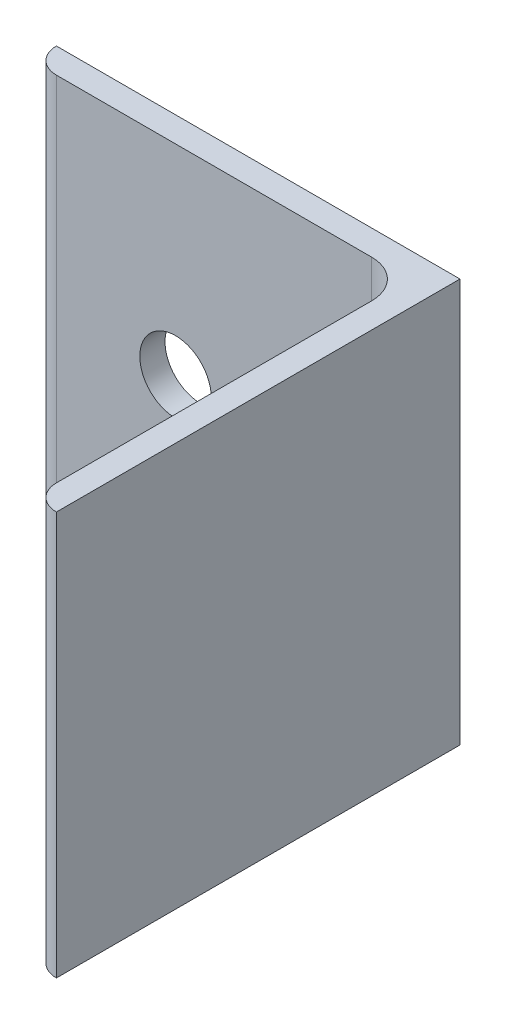
ISO-10303-21;
HEADER;
FILE_DESCRIPTION(('STEP AP214'),'2;1');
FILE_NAME('part.step','',(''),(''),'','','');
FILE_SCHEMA(('AUTOMOTIVE_DESIGN { 1 0 10303 214 1 1 1 1 }'));
ENDSEC;
DATA;
#1=APPLICATION_CONTEXT('core data for automotive mechanical design processes');
#2=APPLICATION_PROTOCOL_DEFINITION('international standard','automotive_design',2000,#1);
#3=PRODUCT_CONTEXT('',#1,'mechanical');
#4=PRODUCT('Part','Part','',(#3));
#5=PRODUCT_RELATED_PRODUCT_CATEGORY('part','',(#4));
#6=PRODUCT_DEFINITION_FORMATION('','',#4);
#7=PRODUCT_DEFINITION_CONTEXT('part definition',#1,'design');
#8=PRODUCT_DEFINITION('design','',#6,#7);
#9=PRODUCT_DEFINITION_SHAPE('','',#8);
#10=(LENGTH_UNIT() NAMED_UNIT(*) SI_UNIT(.MILLI.,.METRE.));
#11=(NAMED_UNIT(*) PLANE_ANGLE_UNIT() SI_UNIT($,.RADIAN.));
#12=(NAMED_UNIT(*) SI_UNIT($,.STERADIAN.) SOLID_ANGLE_UNIT());
#13=UNCERTAINTY_MEASURE_WITH_UNIT(LENGTH_MEASURE(1.E-05),#10,'distance_accuracy_value','');
#14=(GEOMETRIC_REPRESENTATION_CONTEXT(3) GLOBAL_UNCERTAINTY_ASSIGNED_CONTEXT((#13)) GLOBAL_UNIT_ASSIGNED_CONTEXT((#10,
#11,#12)) REPRESENTATION_CONTEXT('',''));
#15=CARTESIAN_POINT('',(0.,0.,0.));
#16=DIRECTION('',(0.,0.,1.));
#17=DIRECTION('',(1.,0.,0.));
#18=AXIS2_PLACEMENT_3D('',#15,#16,#17);
#19=CARTESIAN_POINT('',(-50.8,50.8,0.));
#20=DIRECTION('',(0.,0.,1.));
#21=DIRECTION('',(1.,0.,0.));
#22=AXIS2_PLACEMENT_3D('',#19,#20,#21);
#23=PLANE('',#22);
#24=CARTESIAN_POINT('',(-32.63008,25.4,0.));
#25=DIRECTION('',(0.,0.,1.));
#26=DIRECTION('',(1.,0.,0.));
#27=AXIS2_PLACEMENT_3D('',#24,#25,#26);
#28=CIRCLE('',#27,4.5);
#29=CARTESIAN_POINT('',(-28.13008,25.4,0.));
#30=VERTEX_POINT('',#29);
#31=EDGE_CURVE('E172',#30,#30,#28,.T.);
#32=ORIENTED_EDGE('',*,*,#31,.T.);
#33=EDGE_LOOP('',(#32));
#34=FACE_BOUND('',#33,.T.);
#35=DIRECTION('',(-1.,0.,0.));
#36=VECTOR('',#35,1.);
#37=CARTESIAN_POINT('',(-50.8,0.,0.));
#38=LINE('',#37,#36);
#39=CARTESIAN_POINT('',(0.,0.,0.));
#40=VERTEX_POINT('',#39);
#41=CARTESIAN_POINT('',(-50.8,0.,0.));
#42=VERTEX_POINT('',#41);
#43=EDGE_CURVE('E168',#40,#42,#38,.T.);
#44=ORIENTED_EDGE('',*,*,#43,.T.);
#45=DIRECTION('',(0.,-1.,0.));
#46=VECTOR('',#45,1.);
#47=CARTESIAN_POINT('',(-50.8,50.8,0.));
#48=LINE('',#47,#46);
#49=CARTESIAN_POINT('',(-50.8,50.8,0.));
#50=VERTEX_POINT('',#49);
#51=EDGE_CURVE('E13',#50,#42,#48,.T.);
#52=ORIENTED_EDGE('',*,*,#51,.F.);
#53=DIRECTION('',(-1.,0.,0.));
#54=VECTOR('',#53,1.);
#55=CARTESIAN_POINT('',(-50.8,50.8,0.));
#56=LINE('',#55,#54);
#57=CARTESIAN_POINT('',(0.,50.8,0.));
#58=VERTEX_POINT('',#57);
#59=EDGE_CURVE('E185',#58,#50,#56,.T.);
#60=ORIENTED_EDGE('',*,*,#59,.F.);
#61=DIRECTION('',(0.,-1.,0.));
#62=VECTOR('',#61,1.);
#63=CARTESIAN_POINT('',(0.,50.8,0.));
#64=LINE('',#63,#62);
#65=EDGE_CURVE('E164',#58,#40,#64,.T.);
#66=ORIENTED_EDGE('',*,*,#65,.T.);
#67=EDGE_LOOP('',(#44,#52,#60,#66));
#68=FACE_BOUND('',#67,.T.);
#69=ADVANCED_FACE('F66',(#34,#68),#23,.F.);
#70=CARTESIAN_POINT('',(-50.8,50.8,0.00508));
#71=DIRECTION('',(1.,0.,0.));
#72=DIRECTION('',(0.,0.,-1.));
#73=AXIS2_PLACEMENT_3D('',#70,#71,#72);
#74=PLANE('',#73);
#75=DIRECTION('',(0.,0.,1.));
#76=VECTOR('',#75,1.);
#77=CARTESIAN_POINT('',(-50.8,0.,0.00508));
#78=LINE('',#77,#76);
#79=CARTESIAN_POINT('',(-50.8,0.,0.00507999999999903));
#80=VERTEX_POINT('',#79);
#81=EDGE_CURVE('E171',#42,#80,#78,.T.);
#82=ORIENTED_EDGE('',*,*,#81,.T.);
#83=DIRECTION('',(0.,-1.,0.));
#84=VECTOR('',#83,1.);
#85=CARTESIAN_POINT('',(-50.8,50.8,0.00507999999999903));
#86=LINE('',#85,#84);
#87=CARTESIAN_POINT('',(-50.8,50.8,0.00507999999999903));
#88=VERTEX_POINT('',#87);
#89=EDGE_CURVE('E74',#88,#80,#86,.T.);
#90=ORIENTED_EDGE('',*,*,#89,.F.);
#91=DIRECTION('',(0.,0.,1.));
#92=VECTOR('',#91,1.);
#93=CARTESIAN_POINT('',(-50.8,50.8,0.00508));
#94=LINE('',#93,#92);
#95=EDGE_CURVE('E128',#50,#88,#94,.T.);
#96=ORIENTED_EDGE('',*,*,#95,.F.);
#97=ORIENTED_EDGE('',*,*,#51,.T.);
#98=EDGE_LOOP('',(#82,#90,#96,#97));
#99=FACE_BOUND('',#98,.T.);
#100=ADVANCED_FACE('F243',(#99),#74,.F.);
#101=CARTESIAN_POINT('',(-47.63008,50.8,0.00507999999999961));
#102=DIRECTION('',(0.,-1.,0.));
#103=DIRECTION('',(0.,0.,-1.));
#104=AXIS2_PLACEMENT_3D('',#101,#102,#103);
#105=CYLINDRICAL_SURFACE('',#104,3.16992);
#106=CARTESIAN_POINT('',(-47.63008,0.,0.00507999999999961));
#107=DIRECTION('',(0.,1.,0.));
#108=DIRECTION('',(0.,0.,1.));
#109=AXIS2_PLACEMENT_3D('',#106,#107,#108);
#110=CIRCLE('',#109,3.16992);
#111=CARTESIAN_POINT('',(-47.63008,0.,3.175));
#112=VERTEX_POINT('',#111);
#113=EDGE_CURVE('E174',#80,#112,#110,.T.);
#114=ORIENTED_EDGE('',*,*,#113,.T.);
#115=DIRECTION('',(0.,-1.,0.));
#116=VECTOR('',#115,1.);
#117=CARTESIAN_POINT('',(-47.63008,50.8,3.175));
#118=LINE('',#117,#116);
#119=CARTESIAN_POINT('',(-47.63008,50.8,3.175));
#120=VERTEX_POINT('',#119);
#121=EDGE_CURVE('E195',#120,#112,#118,.T.);
#122=ORIENTED_EDGE('',*,*,#121,.F.);
#123=CARTESIAN_POINT('',(-47.63008,50.8,0.00507999999999961));
#124=DIRECTION('',(0.,1.,0.));
#125=DIRECTION('',(0.,0.,1.));
#126=AXIS2_PLACEMENT_3D('',#123,#124,#125);
#127=CIRCLE('',#126,3.16992);
#128=EDGE_CURVE('E203',#88,#120,#127,.T.);
#129=ORIENTED_EDGE('',*,*,#128,.F.);
#130=ORIENTED_EDGE('',*,*,#89,.T.);
#131=EDGE_LOOP('',(#114,#122,#129,#130));
#132=FACE_BOUND('',#131,.T.);
#133=ADVANCED_FACE('F201',(#132),#105,.T.);
#134=CARTESIAN_POINT('',(-7.93750000000001,50.8,3.17499999999999));
#135=DIRECTION('',(0.,0.,-1.));
#136=DIRECTION('',(-1.,0.,0.));
#137=AXIS2_PLACEMENT_3D('',#134,#135,#136);
#138=PLANE('',#137);
#139=CARTESIAN_POINT('',(-32.63008,25.4,3.17499999999999));
#140=DIRECTION('',(0.,0.,1.));
#141=DIRECTION('',(1.,0.,0.));
#142=AXIS2_PLACEMENT_3D('',#139,#140,#141);
#143=CIRCLE('',#142,4.5);
#144=CARTESIAN_POINT('',(-28.13008,25.4,3.17499999999999));
#145=VERTEX_POINT('',#144);
#146=EDGE_CURVE('E228',#145,#145,#143,.T.);
#147=ORIENTED_EDGE('',*,*,#146,.F.);
#148=EDGE_LOOP('',(#147));
#149=FACE_BOUND('',#148,.T.);
#150=DIRECTION('',(1.,0.,0.));
#151=VECTOR('',#150,1.);
#152=CARTESIAN_POINT('',(-7.93750000000001,0.,3.17499999999999));
#153=LINE('',#152,#151);
#154=CARTESIAN_POINT('',(-7.93750000000001,0.,3.17499999999999));
#155=VERTEX_POINT('',#154);
#156=EDGE_CURVE('E176',#112,#155,#153,.T.);
#157=ORIENTED_EDGE('',*,*,#156,.T.);
#158=DIRECTION('',(0.,-1.,0.));
#159=VECTOR('',#158,1.);
#160=CARTESIAN_POINT('',(-7.93750000000001,50.8,3.17499999999999));
#161=LINE('',#160,#159);
#162=CARTESIAN_POINT('',(-7.93750000000001,50.8,3.17499999999999));
#163=VERTEX_POINT('',#162);
#164=EDGE_CURVE('E192',#163,#155,#161,.T.);
#165=ORIENTED_EDGE('',*,*,#164,.F.);
#166=DIRECTION('',(1.,0.,0.));
#167=VECTOR('',#166,1.);
#168=CARTESIAN_POINT('',(-7.93750000000001,50.8,3.17499999999999));
#169=LINE('',#168,#167);
#170=EDGE_CURVE('E219',#120,#163,#169,.T.);
#171=ORIENTED_EDGE('',*,*,#170,.F.);
#172=ORIENTED_EDGE('',*,*,#121,.T.);
#173=EDGE_LOOP('',(#157,#165,#171,#172));
#174=FACE_BOUND('',#173,.T.);
#175=ADVANCED_FACE('F212',(#149,#174),#138,.F.);
#176=CARTESIAN_POINT('',(-7.93750000000001,50.8,7.93749999999999));
#177=DIRECTION('',(0.,-1.,0.));
#178=DIRECTION('',(0.,0.,-1.));
#179=AXIS2_PLACEMENT_3D('',#176,#177,#178);
#180=CYLINDRICAL_SURFACE('',#179,4.7625);
#181=CARTESIAN_POINT('',(-7.93750000000001,0.,7.93749999999999));
#182=DIRECTION('',(0.,-1.,0.));
#183=DIRECTION('',(0.,0.,-1.));
#184=AXIS2_PLACEMENT_3D('',#181,#182,#183);
#185=CIRCLE('',#184,4.7625);
#186=CARTESIAN_POINT('',(-3.17500000000001,0.,7.93749999999999));
#187=VERTEX_POINT('',#186);
#188=EDGE_CURVE('E178',#155,#187,#185,.T.);
#189=ORIENTED_EDGE('',*,*,#188,.T.);
#190=DIRECTION('',(0.,-1.,0.));
#191=VECTOR('',#190,1.);
#192=CARTESIAN_POINT('',(-3.17500000000001,50.8,7.93749999999999));
#193=LINE('',#192,#191);
#194=CARTESIAN_POINT('',(-3.17500000000001,50.8,7.93749999999999));
#195=VERTEX_POINT('',#194);
#196=EDGE_CURVE('E189',#195,#187,#193,.T.);
#197=ORIENTED_EDGE('',*,*,#196,.F.);
#198=CARTESIAN_POINT('',(-7.93750000000001,50.8,7.93749999999999));
#199=DIRECTION('',(0.,-1.,0.));
#200=DIRECTION('',(0.,0.,-1.));
#201=AXIS2_PLACEMENT_3D('',#198,#199,#200);
#202=CIRCLE('',#201,4.7625);
#203=EDGE_CURVE('E218',#163,#195,#202,.T.);
#204=ORIENTED_EDGE('',*,*,#203,.F.);
#205=ORIENTED_EDGE('',*,*,#164,.T.);
#206=EDGE_LOOP('',(#189,#197,#204,#205));
#207=FACE_BOUND('',#206,.T.);
#208=ADVANCED_FACE('F216',(#207),#180,.F.);
#209=CARTESIAN_POINT('',(-3.175,50.8,47.63008));
#210=DIRECTION('',(1.,0.,0.));
#211=DIRECTION('',(0.,0.,-1.));
#212=AXIS2_PLACEMENT_3D('',#209,#210,#211);
#213=PLANE('',#212);
#214=DIRECTION('',(0.,0.,1.));
#215=VECTOR('',#214,1.);
#216=CARTESIAN_POINT('',(-3.175,0.,47.63008));
#217=LINE('',#216,#215);
#218=CARTESIAN_POINT('',(-3.175,0.,47.63008));
#219=VERTEX_POINT('',#218);
#220=EDGE_CURVE('E180',#187,#219,#217,.T.);
#221=ORIENTED_EDGE('',*,*,#220,.T.);
#222=DIRECTION('',(0.,-1.,0.));
#223=VECTOR('',#222,1.);
#224=CARTESIAN_POINT('',(-3.175,50.8,47.63008));
#225=LINE('',#224,#223);
#226=CARTESIAN_POINT('',(-3.175,50.8,47.63008));
#227=VERTEX_POINT('',#226);
#228=EDGE_CURVE('E159',#227,#219,#225,.T.);
#229=ORIENTED_EDGE('',*,*,#228,.F.);
#230=DIRECTION('',(0.,0.,1.));
#231=VECTOR('',#230,1.);
#232=CARTESIAN_POINT('',(-3.175,50.8,47.63008));
#233=LINE('',#232,#231);
#234=EDGE_CURVE('E150',#195,#227,#233,.T.);
#235=ORIENTED_EDGE('',*,*,#234,.F.);
#236=ORIENTED_EDGE('',*,*,#196,.T.);
#237=EDGE_LOOP('',(#221,#229,#235,#236));
#238=FACE_BOUND('',#237,.T.);
#239=ADVANCED_FACE('F241',(#238),#213,.F.);
#240=CARTESIAN_POINT('',(-0.00508000000000019,50.8,47.63008));
#241=DIRECTION('',(0.,-1.,0.));
#242=DIRECTION('',(0.,0.,-1.));
#243=AXIS2_PLACEMENT_3D('',#240,#241,#242);
#244=CYLINDRICAL_SURFACE('',#243,3.16992);
#245=CARTESIAN_POINT('',(-0.00508000000000019,0.,47.63008));
#246=DIRECTION('',(0.,1.,0.));
#247=DIRECTION('',(0.,0.,-1.));
#248=AXIS2_PLACEMENT_3D('',#245,#246,#247);
#249=CIRCLE('',#248,3.16992);
#250=CARTESIAN_POINT('',(-0.00508,0.,50.8));
#251=VERTEX_POINT('',#250);
#252=EDGE_CURVE('E158',#219,#251,#249,.T.);
#253=ORIENTED_EDGE('',*,*,#252,.T.);
#254=DIRECTION('',(0.,-1.,0.));
#255=VECTOR('',#254,1.);
#256=CARTESIAN_POINT('',(-0.00508,50.8,50.8));
#257=LINE('',#256,#255);
#258=CARTESIAN_POINT('',(-0.00508,50.8,50.8));
#259=VERTEX_POINT('',#258);
#260=EDGE_CURVE('E155',#259,#251,#257,.T.);
#261=ORIENTED_EDGE('',*,*,#260,.F.);
#262=CARTESIAN_POINT('',(-0.00508000000000019,50.8,47.63008));
#263=DIRECTION('',(0.,1.,0.));
#264=DIRECTION('',(0.,0.,-1.));
#265=AXIS2_PLACEMENT_3D('',#262,#263,#264);
#266=CIRCLE('',#265,3.16992);
#267=EDGE_CURVE('E144',#227,#259,#266,.T.);
#268=ORIENTED_EDGE('',*,*,#267,.F.);
#269=ORIENTED_EDGE('',*,*,#228,.T.);
#270=EDGE_LOOP('',(#253,#261,#268,#269));
#271=FACE_BOUND('',#270,.T.);
#272=ADVANCED_FACE('F156',(#271),#244,.T.);
#273=CARTESIAN_POINT('',(0.,50.8,50.8));
#274=DIRECTION('',(0.,0.,-1.));
#275=DIRECTION('',(-1.,0.,0.));
#276=AXIS2_PLACEMENT_3D('',#273,#274,#275);
#277=PLANE('',#276);
#278=DIRECTION('',(1.,0.,0.));
#279=VECTOR('',#278,1.);
#280=CARTESIAN_POINT('',(0.,0.,50.8));
#281=LINE('',#280,#279);
#282=CARTESIAN_POINT('',(0.,0.,50.8));
#283=VERTEX_POINT('',#282);
#284=EDGE_CURVE('E114',#251,#283,#281,.T.);
#285=ORIENTED_EDGE('',*,*,#284,.T.);
#286=DIRECTION('',(0.,-1.,0.));
#287=VECTOR('',#286,1.);
#288=CARTESIAN_POINT('',(0.,50.8,50.8));
#289=LINE('',#288,#287);
#290=CARTESIAN_POINT('',(0.,50.8,50.8));
#291=VERTEX_POINT('',#290);
#292=EDGE_CURVE('E160',#291,#283,#289,.T.);
#293=ORIENTED_EDGE('',*,*,#292,.F.);
#294=DIRECTION('',(1.,0.,0.));
#295=VECTOR('',#294,1.);
#296=CARTESIAN_POINT('',(0.,50.8,50.8));
#297=LINE('',#296,#295);
#298=EDGE_CURVE('E148',#259,#291,#297,.T.);
#299=ORIENTED_EDGE('',*,*,#298,.F.);
#300=ORIENTED_EDGE('',*,*,#260,.T.);
#301=EDGE_LOOP('',(#285,#293,#299,#300));
#302=FACE_BOUND('',#301,.T.);
#303=ADVANCED_FACE('F162',(#302),#277,.F.);
#304=CARTESIAN_POINT('',(0.,50.8,0.));
#305=DIRECTION('',(-1.,0.,0.));
#306=DIRECTION('',(0.,0.,1.));
#307=AXIS2_PLACEMENT_3D('',#304,#305,#306);
#308=PLANE('',#307);
#309=DIRECTION('',(0.,0.,-1.));
#310=VECTOR('',#309,1.);
#311=CARTESIAN_POINT('',(0.,0.,0.));
#312=LINE('',#311,#310);
#313=EDGE_CURVE('E120',#283,#40,#312,.T.);
#314=ORIENTED_EDGE('',*,*,#313,.T.);
#315=ORIENTED_EDGE('',*,*,#65,.F.);
#316=DIRECTION('',(0.,0.,-1.));
#317=VECTOR('',#316,1.);
#318=CARTESIAN_POINT('',(0.,50.8,0.));
#319=LINE('',#318,#317);
#320=EDGE_CURVE('E82',#291,#58,#319,.T.);
#321=ORIENTED_EDGE('',*,*,#320,.F.);
#322=ORIENTED_EDGE('',*,*,#292,.T.);
#323=EDGE_LOOP('',(#314,#315,#321,#322));
#324=FACE_BOUND('',#323,.T.);
#325=ADVANCED_FACE('F264',(#324),#308,.F.);
#326=CARTESIAN_POINT('',(-0.00508000000000019,50.8,47.63008));
#327=DIRECTION('',(0.,-1.,0.));
#328=DIRECTION('',(0.,0.,-1.));
#329=AXIS2_PLACEMENT_3D('',#326,#327,#328);
#330=PLANE('',#329);
#331=ORIENTED_EDGE('',*,*,#59,.T.);
#332=ORIENTED_EDGE('',*,*,#95,.T.);
#333=ORIENTED_EDGE('',*,*,#128,.T.);
#334=ORIENTED_EDGE('',*,*,#170,.T.);
#335=ORIENTED_EDGE('',*,*,#203,.T.);
#336=ORIENTED_EDGE('',*,*,#234,.T.);
#337=ORIENTED_EDGE('',*,*,#267,.T.);
#338=ORIENTED_EDGE('',*,*,#298,.T.);
#339=ORIENTED_EDGE('',*,*,#320,.T.);
#340=EDGE_LOOP('',(#331,#332,#333,#334,#335,#336,#337,#338,#339));
#341=FACE_BOUND('',#340,.T.);
#342=ADVANCED_FACE('F146',(#341),#330,.F.);
#343=CARTESIAN_POINT('',(-0.00508000000000019,0.,47.63008));
#344=DIRECTION('',(0.,-1.,0.));
#345=DIRECTION('',(0.,0.,-1.));
#346=AXIS2_PLACEMENT_3D('',#343,#344,#345);
#347=PLANE('',#346);
#348=ORIENTED_EDGE('',*,*,#43,.F.);
#349=ORIENTED_EDGE('',*,*,#313,.F.);
#350=ORIENTED_EDGE('',*,*,#284,.F.);
#351=ORIENTED_EDGE('',*,*,#252,.F.);
#352=ORIENTED_EDGE('',*,*,#220,.F.);
#353=ORIENTED_EDGE('',*,*,#188,.F.);
#354=ORIENTED_EDGE('',*,*,#156,.F.);
#355=ORIENTED_EDGE('',*,*,#113,.F.);
#356=ORIENTED_EDGE('',*,*,#81,.F.);
#357=EDGE_LOOP('',(#348,#349,#350,#351,#352,#353,#354,#355,#356));
#358=FACE_BOUND('',#357,.T.);
#359=ADVANCED_FACE('F207',(#358),#347,.T.);
#360=CARTESIAN_POINT('',(-32.63008,25.4,-6.82500000000001));
#361=DIRECTION('',(0.,0.,1.));
#362=DIRECTION('',(1.,0.,0.));
#363=AXIS2_PLACEMENT_3D('',#360,#361,#362);
#364=CYLINDRICAL_SURFACE('',#363,4.5);
#365=ORIENTED_EDGE('',*,*,#146,.T.);
#366=EDGE_LOOP('',(#365));
#367=FACE_BOUND('',#366,.T.);
#368=ORIENTED_EDGE('',*,*,#31,.F.);
#369=EDGE_LOOP('',(#368));
#370=FACE_BOUND('',#369,.T.);
#371=ADVANCED_FACE('F232',(#367,#370),#364,.F.);
#372=CLOSED_SHELL('',(#69,#100,#133,#175,#208,#239,#272,#303,#325,#342,#359,#371));
#373=MANIFOLD_SOLID_BREP('B2',#372);
#374=ADVANCED_BREP_SHAPE_REPRESENTATION('',(#18,#373),#14);
#375=SHAPE_DEFINITION_REPRESENTATION(#9,#374);
ENDSEC;
END-ISO-10303-21;
